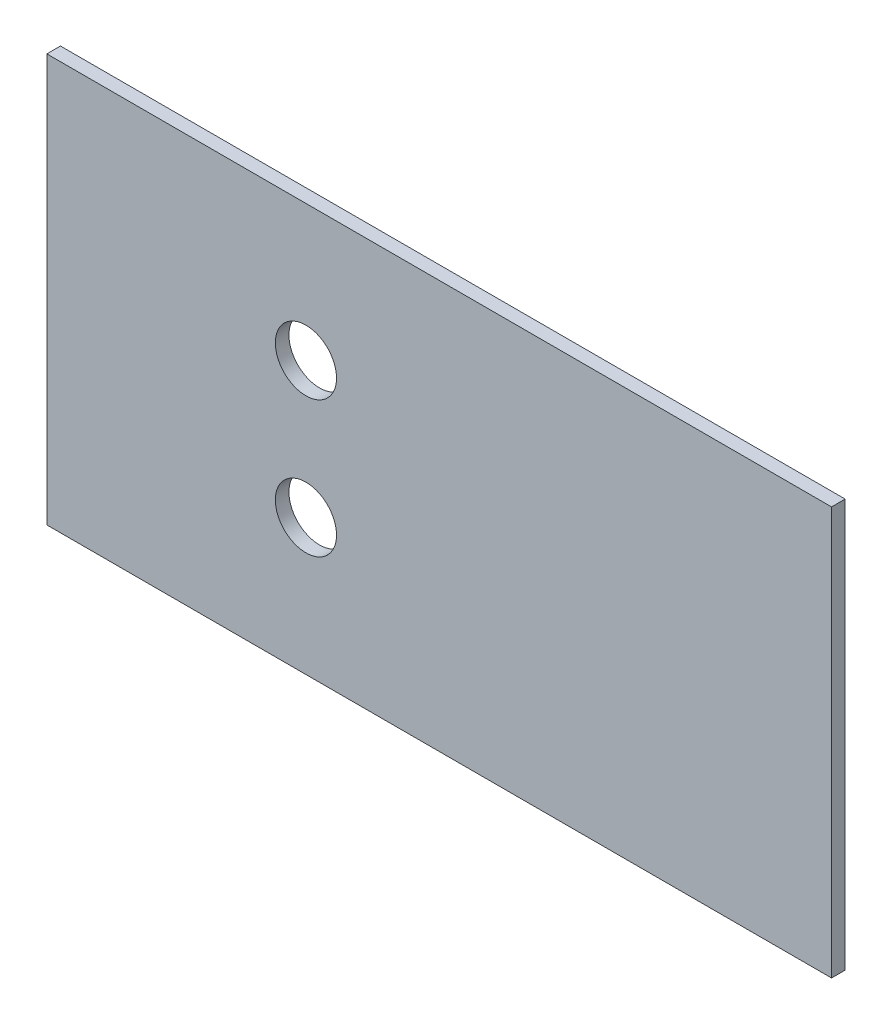
ISO-10303-21;
HEADER;
FILE_DESCRIPTION(('STEP AP214'),'2;1');
FILE_NAME('part.step','',(''),(''),'','','');
FILE_SCHEMA(('AUTOMOTIVE_DESIGN { 1 0 10303 214 1 1 1 1 }'));
ENDSEC;
DATA;
#1=APPLICATION_CONTEXT('core data for automotive mechanical design processes');
#2=APPLICATION_PROTOCOL_DEFINITION('international standard','automotive_design',2000,#1);
#3=PRODUCT_CONTEXT('',#1,'mechanical');
#4=PRODUCT('Part','Part','',(#3));
#5=PRODUCT_RELATED_PRODUCT_CATEGORY('part','',(#4));
#6=PRODUCT_DEFINITION_FORMATION('','',#4);
#7=PRODUCT_DEFINITION_CONTEXT('part definition',#1,'design');
#8=PRODUCT_DEFINITION('design','',#6,#7);
#9=PRODUCT_DEFINITION_SHAPE('','',#8);
#10=(LENGTH_UNIT() NAMED_UNIT(*) SI_UNIT(.MILLI.,.METRE.));
#11=(NAMED_UNIT(*) PLANE_ANGLE_UNIT() SI_UNIT($,.RADIAN.));
#12=(NAMED_UNIT(*) SI_UNIT($,.STERADIAN.) SOLID_ANGLE_UNIT());
#13=UNCERTAINTY_MEASURE_WITH_UNIT(LENGTH_MEASURE(1.E-05),#10,'distance_accuracy_value','');
#14=(GEOMETRIC_REPRESENTATION_CONTEXT(3) GLOBAL_UNCERTAINTY_ASSIGNED_CONTEXT((#13)) GLOBAL_UNIT_ASSIGNED_CONTEXT((#10,
#11,#12)) REPRESENTATION_CONTEXT('',''));
#15=CARTESIAN_POINT('',(0.,0.,0.));
#16=DIRECTION('',(0.,0.,1.));
#17=DIRECTION('',(1.,0.,0.));
#18=AXIS2_PLACEMENT_3D('',#15,#16,#17);
#19=CARTESIAN_POINT('',(8.10000000000661,0.,1.));
#20=DIRECTION('',(1.,0.,0.));
#21=DIRECTION('',(0.,1.,0.));
#22=AXIS2_PLACEMENT_3D('',#19,#20,#21);
#23=PLANE('',#22);
#24=DIRECTION('',(0.,-1.,0.));
#25=VECTOR('',#24,1.);
#26=CARTESIAN_POINT('',(8.10000000000661,0.,0.));
#27=LINE('',#26,#25);
#28=CARTESIAN_POINT('',(8.10000000000661,36.9999999999999,0.));
#29=VERTEX_POINT('',#28);
#30=CARTESIAN_POINT('',(8.10000000000661,6.99999999999988,0.));
#31=VERTEX_POINT('',#30);
#32=EDGE_CURVE('E110',#29,#31,#27,.T.);
#33=ORIENTED_EDGE('',*,*,#32,.F.);
#34=DIRECTION('',(0.,0.,-1.));
#35=VECTOR('',#34,1.);
#36=CARTESIAN_POINT('',(8.10000000000661,36.9999999999999,1.));
#37=LINE('',#36,#35);
#38=CARTESIAN_POINT('',(8.10000000000661,36.9999999999999,1.));
#39=VERTEX_POINT('',#38);
#40=EDGE_CURVE('E11',#39,#29,#37,.T.);
#41=ORIENTED_EDGE('',*,*,#40,.F.);
#42=DIRECTION('',(0.,-1.,0.));
#43=VECTOR('',#42,1.);
#44=CARTESIAN_POINT('',(8.10000000000661,0.,1.));
#45=LINE('',#44,#43);
#46=CARTESIAN_POINT('',(8.10000000000661,6.99999999999988,1.));
#47=VERTEX_POINT('',#46);
#48=EDGE_CURVE('E97',#39,#47,#45,.T.);
#49=ORIENTED_EDGE('',*,*,#48,.T.);
#50=DIRECTION('',(0.,0.,-1.));
#51=VECTOR('',#50,1.);
#52=CARTESIAN_POINT('',(8.10000000000661,6.99999999999988,1.));
#53=LINE('',#52,#51);
#54=EDGE_CURVE('E55',#47,#31,#53,.T.);
#55=ORIENTED_EDGE('',*,*,#54,.T.);
#56=EDGE_LOOP('',(#33,#41,#49,#55));
#57=FACE_BOUND('',#56,.T.);
#58=ADVANCED_FACE('F38',(#57),#23,.T.);
#59=CARTESIAN_POINT('',(0.,36.9999999999999,1.));
#60=DIRECTION('',(0.,1.,0.));
#61=DIRECTION('',(0.,0.,1.));
#62=AXIS2_PLACEMENT_3D('',#59,#60,#61);
#63=PLANE('',#62);
#64=DIRECTION('',(1.,0.,0.));
#65=VECTOR('',#64,1.);
#66=CARTESIAN_POINT('',(0.,36.9999999999999,0.));
#67=LINE('',#66,#65);
#68=CARTESIAN_POINT('',(-49.599999999999,36.9999999999999,0.));
#69=VERTEX_POINT('',#68);
#70=EDGE_CURVE('E87',#69,#29,#67,.T.);
#71=ORIENTED_EDGE('',*,*,#70,.F.);
#72=DIRECTION('',(0.,0.,-1.));
#73=VECTOR('',#72,1.);
#74=CARTESIAN_POINT('',(-49.599999999999,36.9999999999999,1.));
#75=LINE('',#74,#73);
#76=CARTESIAN_POINT('',(-49.599999999999,36.9999999999999,1.));
#77=VERTEX_POINT('',#76);
#78=EDGE_CURVE('E47',#77,#69,#75,.T.);
#79=ORIENTED_EDGE('',*,*,#78,.F.);
#80=DIRECTION('',(1.,0.,0.));
#81=VECTOR('',#80,1.);
#82=CARTESIAN_POINT('',(0.,36.9999999999999,1.));
#83=LINE('',#82,#81);
#84=EDGE_CURVE('E85',#77,#39,#83,.T.);
#85=ORIENTED_EDGE('',*,*,#84,.T.);
#86=ORIENTED_EDGE('',*,*,#40,.T.);
#87=EDGE_LOOP('',(#71,#79,#85,#86));
#88=FACE_BOUND('',#87,.T.);
#89=ADVANCED_FACE('F83',(#88),#63,.T.);
#90=CARTESIAN_POINT('',(-49.6000000000003,0.,1.));
#91=DIRECTION('',(1.,0.,0.));
#92=DIRECTION('',(0.,0.,-1.));
#93=AXIS2_PLACEMENT_3D('',#90,#91,#92);
#94=PLANE('',#93);
#95=DIRECTION('',(0.,-1.,0.));
#96=VECTOR('',#95,1.);
#97=CARTESIAN_POINT('',(-49.6000000000003,0.,0.));
#98=LINE('',#97,#96);
#99=CARTESIAN_POINT('',(-49.6000000000003,6.99999999999988,0.));
#100=VERTEX_POINT('',#99);
#101=EDGE_CURVE('E113',#69,#100,#98,.T.);
#102=ORIENTED_EDGE('',*,*,#101,.T.);
#103=DIRECTION('',(0.,0.,-1.));
#104=VECTOR('',#103,1.);
#105=CARTESIAN_POINT('',(-49.6000000000003,6.99999999999988,1.));
#106=LINE('',#105,#104);
#107=CARTESIAN_POINT('',(-49.6000000000003,6.99999999999988,1.));
#108=VERTEX_POINT('',#107);
#109=EDGE_CURVE('E69',#108,#100,#106,.T.);
#110=ORIENTED_EDGE('',*,*,#109,.F.);
#111=DIRECTION('',(0.,-1.,0.));
#112=VECTOR('',#111,1.);
#113=CARTESIAN_POINT('',(-49.6000000000003,0.,1.));
#114=LINE('',#113,#112);
#115=EDGE_CURVE('E90',#77,#108,#114,.T.);
#116=ORIENTED_EDGE('',*,*,#115,.F.);
#117=ORIENTED_EDGE('',*,*,#78,.T.);
#118=EDGE_LOOP('',(#102,#110,#116,#117));
#119=FACE_BOUND('',#118,.T.);
#120=ADVANCED_FACE('F91',(#119),#94,.F.);
#121=CARTESIAN_POINT('',(-30.5499999999998,16.9999999999999,1.));
#122=DIRECTION('',(0.,0.,-1.));
#123=DIRECTION('',(-1.,0.,0.));
#124=AXIS2_PLACEMENT_3D('',#121,#122,#123);
#125=CYLINDRICAL_SURFACE('',#124,2.25);
#126=CARTESIAN_POINT('',(-30.5499999999998,16.9999999999999,1.));
#127=DIRECTION('',(0.,0.,1.));
#128=DIRECTION('',(1.,0.,0.));
#129=AXIS2_PLACEMENT_3D('',#126,#127,#128);
#130=CIRCLE('',#129,2.25);
#131=CARTESIAN_POINT('',(-28.2999999999998,16.9999999999999,1.));
#132=VERTEX_POINT('',#131);
#133=EDGE_CURVE('E99',#132,#132,#130,.T.);
#134=ORIENTED_EDGE('',*,*,#133,.T.);
#135=EDGE_LOOP('',(#134));
#136=FACE_BOUND('',#135,.T.);
#137=CARTESIAN_POINT('',(-30.5499999999998,16.9999999999999,0.));
#138=DIRECTION('',(0.,0.,1.));
#139=DIRECTION('',(1.,0.,0.));
#140=AXIS2_PLACEMENT_3D('',#137,#138,#139);
#141=CIRCLE('',#140,2.25);
#142=CARTESIAN_POINT('',(-28.2999999999998,16.9999999999999,0.));
#143=VERTEX_POINT('',#142);
#144=EDGE_CURVE('E107',#143,#143,#141,.T.);
#145=ORIENTED_EDGE('',*,*,#144,.F.);
#146=EDGE_LOOP('',(#145));
#147=FACE_BOUND('',#146,.T.);
#148=ADVANCED_FACE('F128',(#136,#147),#125,.F.);
#149=CARTESIAN_POINT('',(-30.5499999999998,26.9999999999999,1.));
#150=DIRECTION('',(0.,0.,-1.));
#151=DIRECTION('',(-1.,0.,0.));
#152=AXIS2_PLACEMENT_3D('',#149,#150,#151);
#153=CYLINDRICAL_SURFACE('',#152,2.25);
#154=CARTESIAN_POINT('',(-30.5499999999998,26.9999999999999,1.));
#155=DIRECTION('',(0.,0.,1.));
#156=DIRECTION('',(1.,0.,0.));
#157=AXIS2_PLACEMENT_3D('',#154,#155,#156);
#158=CIRCLE('',#157,2.25);
#159=CARTESIAN_POINT('',(-28.2999999999998,26.9999999999999,1.));
#160=VERTEX_POINT('',#159);
#161=EDGE_CURVE('E118',#160,#160,#158,.T.);
#162=ORIENTED_EDGE('',*,*,#161,.T.);
#163=EDGE_LOOP('',(#162));
#164=FACE_BOUND('',#163,.T.);
#165=CARTESIAN_POINT('',(-30.5499999999998,26.9999999999999,0.));
#166=DIRECTION('',(0.,0.,1.));
#167=DIRECTION('',(1.,0.,0.));
#168=AXIS2_PLACEMENT_3D('',#165,#166,#167);
#169=CIRCLE('',#168,2.25);
#170=CARTESIAN_POINT('',(-28.2999999999998,26.9999999999999,0.));
#171=VERTEX_POINT('',#170);
#172=EDGE_CURVE('E104',#171,#171,#169,.T.);
#173=ORIENTED_EDGE('',*,*,#172,.F.);
#174=EDGE_LOOP('',(#173));
#175=FACE_BOUND('',#174,.T.);
#176=ADVANCED_FACE('F40',(#164,#175),#153,.F.);
#177=CARTESIAN_POINT('',(0.,6.99999999999988,1.));
#178=DIRECTION('',(0.,-1.,0.));
#179=DIRECTION('',(0.,0.,-1.));
#180=AXIS2_PLACEMENT_3D('',#177,#178,#179);
#181=PLANE('',#180);
#182=DIRECTION('',(-1.,0.,0.));
#183=VECTOR('',#182,1.);
#184=CARTESIAN_POINT('',(0.,6.99999999999988,0.));
#185=LINE('',#184,#183);
#186=EDGE_CURVE('E115',#31,#100,#185,.T.);
#187=ORIENTED_EDGE('',*,*,#186,.F.);
#188=ORIENTED_EDGE('',*,*,#54,.F.);
#189=DIRECTION('',(-1.,0.,0.));
#190=VECTOR('',#189,1.);
#191=CARTESIAN_POINT('',(0.,6.99999999999988,1.));
#192=LINE('',#191,#190);
#193=EDGE_CURVE('E94',#47,#108,#192,.T.);
#194=ORIENTED_EDGE('',*,*,#193,.T.);
#195=ORIENTED_EDGE('',*,*,#109,.T.);
#196=EDGE_LOOP('',(#187,#188,#194,#195));
#197=FACE_BOUND('',#196,.T.);
#198=ADVANCED_FACE('F133',(#197),#181,.T.);
#199=CARTESIAN_POINT('',(0.,0.,1.));
#200=DIRECTION('',(0.,0.,1.));
#201=DIRECTION('',(1.,0.,0.));
#202=AXIS2_PLACEMENT_3D('',#199,#200,#201);
#203=PLANE('',#202);
#204=ORIENTED_EDGE('',*,*,#161,.F.);
#205=EDGE_LOOP('',(#204));
#206=FACE_BOUND('',#205,.T.);
#207=ORIENTED_EDGE('',*,*,#133,.F.);
#208=EDGE_LOOP('',(#207));
#209=FACE_BOUND('',#208,.T.);
#210=ORIENTED_EDGE('',*,*,#48,.F.);
#211=ORIENTED_EDGE('',*,*,#84,.F.);
#212=ORIENTED_EDGE('',*,*,#115,.T.);
#213=ORIENTED_EDGE('',*,*,#193,.F.);
#214=EDGE_LOOP('',(#210,#211,#212,#213));
#215=FACE_BOUND('',#214,.T.);
#216=ADVANCED_FACE('F96',(#206,#209,#215),#203,.T.);
#217=CARTESIAN_POINT('',(0.,0.,0.));
#218=DIRECTION('',(0.,0.,1.));
#219=DIRECTION('',(1.,0.,0.));
#220=AXIS2_PLACEMENT_3D('',#217,#218,#219);
#221=PLANE('',#220);
#222=ORIENTED_EDGE('',*,*,#172,.T.);
#223=EDGE_LOOP('',(#222));
#224=FACE_BOUND('',#223,.T.);
#225=ORIENTED_EDGE('',*,*,#144,.T.);
#226=EDGE_LOOP('',(#225));
#227=FACE_BOUND('',#226,.T.);
#228=ORIENTED_EDGE('',*,*,#32,.T.);
#229=ORIENTED_EDGE('',*,*,#186,.T.);
#230=ORIENTED_EDGE('',*,*,#101,.F.);
#231=ORIENTED_EDGE('',*,*,#70,.T.);
#232=EDGE_LOOP('',(#228,#229,#230,#231));
#233=FACE_BOUND('',#232,.T.);
#234=ADVANCED_FACE('F132',(#224,#227,#233),#221,.F.);
#235=CLOSED_SHELL('',(#58,#89,#120,#148,#176,#198,#216,#234));
#236=MANIFOLD_SOLID_BREP('B2',#235);
#237=ADVANCED_BREP_SHAPE_REPRESENTATION('',(#18,#236),#14);
#238=SHAPE_DEFINITION_REPRESENTATION(#9,#237);
ENDSEC;
END-ISO-10303-21;
